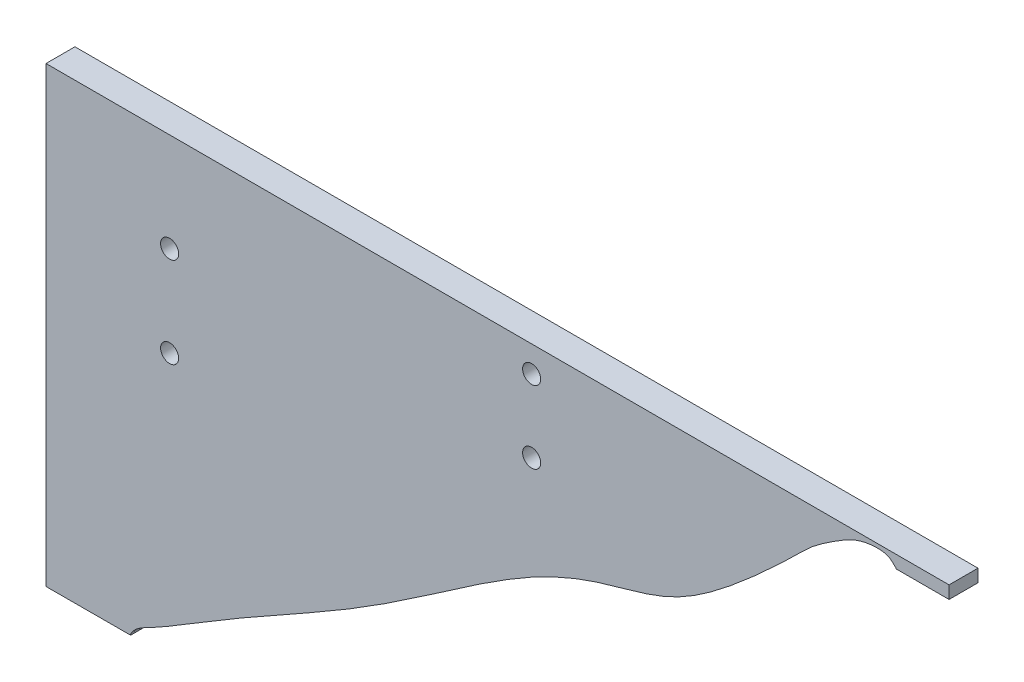
ISO-10303-21;
HEADER;
FILE_DESCRIPTION(('STEP AP214'),'2;1');
FILE_NAME('part.step','',(''),(''),'','','');
FILE_SCHEMA(('AUTOMOTIVE_DESIGN { 1 0 10303 214 1 1 1 1 }'));
ENDSEC;
DATA;
#1=APPLICATION_CONTEXT('core data for automotive mechanical design processes');
#2=APPLICATION_PROTOCOL_DEFINITION('international standard','automotive_design',2000,#1);
#3=PRODUCT_CONTEXT('',#1,'mechanical');
#4=PRODUCT('Part','Part','',(#3));
#5=PRODUCT_RELATED_PRODUCT_CATEGORY('part','',(#4));
#6=PRODUCT_DEFINITION_FORMATION('','',#4);
#7=PRODUCT_DEFINITION_CONTEXT('part definition',#1,'design');
#8=PRODUCT_DEFINITION('design','',#6,#7);
#9=PRODUCT_DEFINITION_SHAPE('','',#8);
#10=(LENGTH_UNIT() NAMED_UNIT(*) SI_UNIT(.MILLI.,.METRE.));
#11=(NAMED_UNIT(*) PLANE_ANGLE_UNIT() SI_UNIT($,.RADIAN.));
#12=(NAMED_UNIT(*) SI_UNIT($,.STERADIAN.) SOLID_ANGLE_UNIT());
#13=UNCERTAINTY_MEASURE_WITH_UNIT(LENGTH_MEASURE(1.E-05),#10,'distance_accuracy_value','');
#14=(GEOMETRIC_REPRESENTATION_CONTEXT(3) GLOBAL_UNCERTAINTY_ASSIGNED_CONTEXT((#13)) GLOBAL_UNIT_ASSIGNED_CONTEXT((#10,
#11,#12)) REPRESENTATION_CONTEXT('',''));
#15=CARTESIAN_POINT('',(0.,0.,0.));
#16=DIRECTION('',(0.,0.,1.));
#17=DIRECTION('',(1.,0.,0.));
#18=AXIS2_PLACEMENT_3D('',#15,#16,#17);
#19=CARTESIAN_POINT('',(-122.475415012518,-122.937391800223,91.9999999999997));
#20=DIRECTION('',(0.,0.,-1.));
#21=DIRECTION('',(-1.,0.,0.));
#22=AXIS2_PLACEMENT_3D('',#19,#20,#21);
#23=PLANE('',#22);
#24=CARTESIAN_POINT('',(-100.,-50.,91.9999999999997));
#25=DIRECTION('',(0.,0.,-1.));
#26=DIRECTION('',(-1.,0.,0.));
#27=AXIS2_PLACEMENT_3D('',#24,#25,#26);
#28=CIRCLE('',#27,2.5);
#29=CARTESIAN_POINT('',(-102.5,-50.,91.9999999999997));
#30=VERTEX_POINT('',#29);
#31=EDGE_CURVE('E199',#30,#30,#28,.F.);
#32=ORIENTED_EDGE('',*,*,#31,.F.);
#33=EDGE_LOOP('',(#32));
#34=FACE_BOUND('',#33,.T.);
#35=CARTESIAN_POINT('',(0.0705666698621599,-4.96037406111782,91.9999999999997));
#36=DIRECTION('',(0.,0.,-1.));
#37=DIRECTION('',(-1.,0.,0.));
#38=AXIS2_PLACEMENT_3D('',#35,#36,#37);
#39=CIRCLE('',#38,2.5);
#40=CARTESIAN_POINT('',(-2.42943333013784,-4.96037406111782,91.9999999999997));
#41=VERTEX_POINT('',#40);
#42=EDGE_CURVE('E187',#41,#41,#39,.F.);
#43=ORIENTED_EDGE('',*,*,#42,.F.);
#44=EDGE_LOOP('',(#43));
#45=FACE_BOUND('',#44,.T.);
#46=CARTESIAN_POINT('',(-110.779909772437,-122.917976824599,91.9999999999997));
#47=CARTESIAN_POINT('',(-118.576912590591,-122.931319085531,91.9999999999997));
#48=CARTESIAN_POINT('',(-126.373916925471,-122.943776546158,91.9999999999997));
#49=CARTESIAN_POINT('',(-134.170921779523,-122.955870682117,91.9999999999997));
#50=B_SPLINE_CURVE_WITH_KNOTS('',3,(#46,#47,#48,#49),.UNSPECIFIED.,.F.,.F.,(4,4),(0.,1.),.UNSPECIFIED.);
#51=CARTESIAN_POINT('',(-134.170921779523,-122.955870682117,91.9999999999997));
#52=VERTEX_POINT('',#51);
#53=CARTESIAN_POINT('',(-110.779909772437,-122.917976824599,91.9999999999997));
#54=VERTEX_POINT('',#53);
#55=EDGE_CURVE('E242',#52,#54,#50,.F.);
#56=ORIENTED_EDGE('',*,*,#55,.T.);
#57=CARTESIAN_POINT('',(100.876446256566,-1.24008902789555,91.9999999999997));
#58=CARTESIAN_POINT('',(100.841434361307,-1.16268302869262,91.9999999999997));
#59=CARTESIAN_POINT('',(100.795758852051,-1.08920582350783,91.9999999999997));
#60=CARTESIAN_POINT('',(100.694552201879,-0.957052484903109,91.9999999999997));
#61=CARTESIAN_POINT('',(100.638433165992,-0.896535745176627,91.9999999999997));
#62=CARTESIAN_POINT('',(100.463510985821,-0.72160322988411,91.9999999999997));
#63=CARTESIAN_POINT('',(100.339864724609,-0.612069397918408,91.9999999999997));
#64=CARTESIAN_POINT('',(100.096476173085,-0.389066465432534,91.9999999999997));
#65=CARTESIAN_POINT('',(99.977048832634,-0.275279890137775,91.9999999999997));
#66=CARTESIAN_POINT('',(99.7325886976846,-0.0533571318301582,91.9999999999997));
#67=CARTESIAN_POINT('',(99.6073133001585,0.0552814369014057,91.9999999999997));
#68=CARTESIAN_POINT('',(99.3501190169673,0.261403634544595,91.9999999999997));
#69=CARTESIAN_POINT('',(99.2180576863766,0.358495245572491,91.9999999999997));
#70=CARTESIAN_POINT('',(98.9410629528159,0.530497322472619,91.9999999999997));
#71=CARTESIAN_POINT('',(98.7965609056477,0.60615110032824,91.9999999999997));
#72=CARTESIAN_POINT('',(98.496281891785,0.738029723443443,91.9999999999997));
#73=CARTESIAN_POINT('',(98.3396401617321,0.794694064636087,91.9999999999997));
#74=CARTESIAN_POINT('',(98.0229449261277,0.891175631249163,91.9999999999997));
#75=CARTESIAN_POINT('',(97.8630532314017,0.93125487294844,91.9999999999997));
#76=CARTESIAN_POINT('',(97.3799894701756,1.03358103658415,91.9999999999997));
#77=CARTESIAN_POINT('',(97.0538125313495,1.07994507721183,91.9999999999997));
#78=CARTESIAN_POINT('',(96.3961078883297,1.14439056871508,91.9999999999997));
#79=CARTESIAN_POINT('',(96.0665866112686,1.15944962433049,91.9999999999997));
#80=CARTESIAN_POINT('',(95.0838366968023,1.16739371510432,91.9999999999997));
#81=CARTESIAN_POINT('',(94.4322845698842,1.12846032068188,91.9999999999997));
#82=CARTESIAN_POINT('',(93.134939397197,0.980121201641978,91.9999999999997));
#83=CARTESIAN_POINT('',(92.4883222303207,0.869756416043662,91.9999999999997));
#84=CARTESIAN_POINT('',(91.2049806622367,0.573919207752296,91.9999999999997));
#85=CARTESIAN_POINT('',(90.5762284552639,0.389217492510174,91.9999999999997));
#86=CARTESIAN_POINT('',(89.345794561168,-0.0572639268071072,91.9999999999997));
#87=CARTESIAN_POINT('',(88.7428792358786,-0.318463771538182,91.9999999999997));
#88=CARTESIAN_POINT('',(87.5601008028295,-0.893972784888488,91.9999999999997));
#89=CARTESIAN_POINT('',(86.9843798106607,-1.20583730253301,91.9999999999997));
#90=CARTESIAN_POINT('',(85.8516475937055,-1.85835662615235,91.9999999999997));
#91=CARTESIAN_POINT('',(85.2946975482809,-2.19910557394236,91.9999999999997));
#92=CARTESIAN_POINT('',(84.1889584545599,-2.8931614802975,91.9999999999997));
#93=CARTESIAN_POINT('',(83.6396615233533,-3.24568691683059,91.9999999999997));
#94=CARTESIAN_POINT('',(82.5463050959655,-3.95879707045348,91.9999999999997));
#95=CARTESIAN_POINT('',(82.0026525497169,-4.32000799553722,91.9999999999997));
#96=CARTESIAN_POINT('',(80.9217280472845,-5.05224819480175,91.9999999999997));
#97=CARTESIAN_POINT('',(80.3847596894359,-5.42374464120453,91.9999999999997));
#98=CARTESIAN_POINT('',(79.3227337258183,-6.18506560723509,91.9999999999997));
#99=CARTESIAN_POINT('',(78.7977798173924,-6.57504969466231,91.9999999999997));
#100=CARTESIAN_POINT('',(77.7673554106563,-7.38499862680852,91.9999999999997));
#101=CARTESIAN_POINT('',(77.2623439069601,-7.80511433379332,91.9999999999997));
#102=CARTESIAN_POINT('',(75.7931655035556,-9.11256261523159,91.9999999999997));
#103=CARTESIAN_POINT('',(74.8738653135943,-10.0511070655327,91.9999999999997));
#104=CARTESIAN_POINT('',(73.4872509377488,-11.4489306435438,91.9999999999997));
#105=CARTESIAN_POINT('',(73.0233566039029,-11.913119672155,91.9999999999997));
#106=CARTESIAN_POINT('',(72.0856875987397,-12.8312511813419,91.9999999999997));
#107=CARTESIAN_POINT('',(71.6129819736303,-13.2863023318747,91.9999999999997));
#108=CARTESIAN_POINT('',(70.1884851503201,-14.6448393653954,91.9999999999997));
#109=CARTESIAN_POINT('',(69.2328499513871,-15.5443387713761,91.9999999999997));
#110=CARTESIAN_POINT('',(67.3210602642904,-17.3427990468695,91.9999999999997));
#111=CARTESIAN_POINT('',(66.36227455184,-18.2393437225724,91.9999999999997));
#112=CARTESIAN_POINT('',(64.4314417002473,-20.0164079380949,91.9999999999997));
#113=CARTESIAN_POINT('',(63.459951980284,-20.8976249785016,91.9999999999997));
#114=CARTESIAN_POINT('',(60.5273679708992,-23.5194574061871,91.9999999999997));
#115=CARTESIAN_POINT('',(58.5493958786976,-25.2397440788112,91.9999999999997));
#116=CARTESIAN_POINT('',(54.5230437172046,-28.5955135136024,91.9999999999997));
#117=CARTESIAN_POINT('',(52.4756271482874,-30.2321567777871,91.9999999999997));
#118=CARTESIAN_POINT('',(49.3193274087806,-32.5845315455701,91.9999999999997));
#119=CARTESIAN_POINT('',(48.2514493387444,-33.3521626116681,91.9999999999997));
#120=CARTESIAN_POINT('',(46.0814896072829,-34.8352074526012,91.9999999999997));
#121=CARTESIAN_POINT('',(44.9835516762248,-35.5470279987799,91.9999999999997));
#122=CARTESIAN_POINT('',(42.7544603940462,-36.894534251084,91.9999999999997));
#123=CARTESIAN_POINT('',(41.6235384725537,-37.5307504294317,91.9999999999997));
#124=CARTESIAN_POINT('',(39.3250431338651,-38.7191719334006,91.9999999999997));
#125=CARTESIAN_POINT('',(38.1573577987336,-39.2711207259387,91.9999999999997));
#126=CARTESIAN_POINT('',(35.7849340022359,-40.2900868594757,91.9999999999997));
#127=CARTESIAN_POINT('',(34.5800929142975,-40.7568689646223,91.9999999999997));
#128=CARTESIAN_POINT('',(32.1395293327347,-41.6196482539924,91.9999999999997));
#129=CARTESIAN_POINT('',(30.9039178901933,-42.01589998434,91.9999999999997));
#130=CARTESIAN_POINT('',(27.1706011089081,-43.1439533275694,91.9999999999997));
#131=CARTESIAN_POINT('',(24.6480854611637,-43.8203816439177,91.9999999999997));
#132=CARTESIAN_POINT('',(20.8983147329225,-44.9070516093297,91.9999999999997));
#133=CARTESIAN_POINT('',(19.6539517476744,-45.2804633253454,91.9999999999997));
#134=CARTESIAN_POINT('',(17.1850349391526,-46.0671445206717,91.9999999999997));
#135=CARTESIAN_POINT('',(15.9605034827833,-46.4804590041466,91.9999999999997));
#136=CARTESIAN_POINT('',(12.3210224662823,-47.7890414982198,91.9999999999997));
#137=CARTESIAN_POINT('',(9.94117621178341,-48.7549404243807,91.9999999999997));
#138=CARTESIAN_POINT('',(2.93798730764382,-51.9269850236628,91.9999999999997));
#139=CARTESIAN_POINT('',(-1.55037774144483,-54.4047174130653,91.9999999999997));
#140=CARTESIAN_POINT('',(-10.3311618683811,-59.7544425927085,91.9999999999997));
#141=CARTESIAN_POINT('',(-14.6257991341576,-62.6228943627703,91.9999999999997));
#142=CARTESIAN_POINT('',(-23.1623666173545,-68.4620677112463,91.9999999999997));
#143=CARTESIAN_POINT('',(-27.4022047169036,-71.4255508076582,91.9999999999997));
#144=CARTESIAN_POINT('',(-35.9481520134817,-77.2502495224671,91.9999999999997));
#145=CARTESIAN_POINT('',(-40.2541037036712,-80.1117082004764,91.9999999999997));
#146=CARTESIAN_POINT('',(-46.8110821322596,-84.2525871558238,91.9999999999997));
#147=CARTESIAN_POINT('',(-49.0125921284208,-85.6084201159259,91.9999999999997));
#148=CARTESIAN_POINT('',(-53.447124025235,-88.271457853976,91.9999999999997));
#149=CARTESIAN_POINT('',(-55.6800810820948,-89.5787626968307,91.9999999999997));
#150=CARTESIAN_POINT('',(-62.4131435910692,-93.4479142249231,91.9999999999997));
#151=CARTESIAN_POINT('',(-66.9447883106522,-95.9532816488879,91.9999999999997));
#152=CARTESIAN_POINT('',(-73.7099355535082,-99.7671392919062,91.9999999999997));
#153=CARTESIAN_POINT('',(-75.9597115067248,-101.047737889698,91.9999999999997));
#154=CARTESIAN_POINT('',(-80.4442864915794,-103.635385388777,91.9999999999997));
#155=CARTESIAN_POINT('',(-82.6789826219114,-104.942451338412,91.9999999999997));
#156=CARTESIAN_POINT('',(-87.134084587971,-107.58066219383,91.9999999999997));
#157=CARTESIAN_POINT('',(-89.3539425718177,-108.912703314124,91.9999999999997));
#158=CARTESIAN_POINT('',(-93.7820176833245,-111.596025105117,91.9999999999997));
#159=CARTESIAN_POINT('',(-95.9931050813148,-112.942583088309,91.9999999999997));
#160=CARTESIAN_POINT('',(-99.3174347800966,-114.949619672127,91.9999999999997));
#161=CARTESIAN_POINT('',(-100.426520581914,-115.61700086954,91.9999999999997));
#162=CARTESIAN_POINT('',(-102.097003321082,-116.606617712562,91.9999999999997));
#163=CARTESIAN_POINT('',(-102.656265300541,-116.932682767015,91.9999999999997));
#164=CARTESIAN_POINT('',(-103.786179076839,-117.563290282006,91.9999999999997));
#165=CARTESIAN_POINT('',(-104.358188779308,-117.865419804243,91.9999999999997));
#166=CARTESIAN_POINT('',(-105.509797140658,-118.455503132099,91.9999999999997));
#167=CARTESIAN_POINT('',(-106.08849213202,-118.745144934588,91.9999999999997));
#168=CARTESIAN_POINT('',(-107.233118169313,-119.34827082611,91.9999999999997));
#169=CARTESIAN_POINT('',(-107.802192065386,-119.660987114854,91.9999999999997));
#170=CARTESIAN_POINT('',(-108.60556256135,-120.196591931237,91.9999999999997));
#171=CARTESIAN_POINT('',(-108.864898964107,-120.386394312925,91.9999999999997));
#172=CARTESIAN_POINT('',(-109.356865349896,-120.801594239617,91.9999999999997));
#173=CARTESIAN_POINT('',(-109.589268482181,-121.030006931974,91.9999999999997));
#174=CARTESIAN_POINT('',(-110.023739984723,-121.513057885008,91.9999999999997));
#175=CARTESIAN_POINT('',(-110.225125681924,-121.766767555702,91.9999999999997));
#176=CARTESIAN_POINT('',(-110.504474164165,-122.164805031038,91.9999999999997));
#177=CARTESIAN_POINT('',(-110.594963214295,-122.30104912406,91.9999999999997));
#178=CARTESIAN_POINT('',(-110.704604184103,-122.520289156973,91.9999999999997));
#179=CARTESIAN_POINT('',(-110.735979330843,-122.595415532006,91.9999999999997));
#180=CARTESIAN_POINT('',(-110.777984443431,-122.753876611485,91.9999999999997));
#181=CARTESIAN_POINT('',(-110.787807921688,-122.835938296205,91.9999999999997));
#182=CARTESIAN_POINT('',(-110.779909772437,-122.917976824599,91.9999999999997));
#183=B_SPLINE_CURVE_WITH_KNOTS('',3,(#57,#58,#59,#60,#61,#62,#63,#64,#65,#66,#67,#68,#69,#70,
#71,#72,#73,#74,#75,#76,#77,#78,#79,#80,#81,#82,#83,#84,#85,#86,#87,#88,#89,#90,#91,#92,#93,#94,
#95,#96,#97,#98,#99,#100,#101,#102,#103,#104,#105,#106,#107,#108,#109,#110,#111,#112,#113,#114,
#115,#116,#117,#118,#119,#120,#121,#122,#123,#124,#125,#126,#127,#128,#129,#130,#131,#132,#133,
#134,#135,#136,#137,#138,#139,#140,#141,#142,#143,#144,#145,#146,#147,#148,#149,#150,#151,#152,
#153,#154,#155,#156,#157,#158,#159,#160,#161,#162,#163,#164,#165,#166,#167,#168,#169,#170,#171,
#172,#173,#174,#175,#176,#177,#178,#179,#180,#181,#182),.UNSPECIFIED.,.F.,.F.,(4,2,2,2,2,2,2,2,
2,2,2,2,2,2,2,2,2,2,2,2,2,2,2,2,2,2,2,2,2,2,2,2,2,2,2,2,2,2,2,2,2,2,2,2,2,2,2,2,2,2,2,2,2,2,2,2,
2,2,2,2,2,2,4),(0.,0.000976562499999889,0.00195312499999978,0.00390624999999978,
0.00585937499999967,0.00781249999999967,0.00976562499999956,0.0117187499999994,
0.0136718749999994,0.0156249999999993,0.0195312499999993,0.0234374999999993,0.0312499999999993,
0.0390624999999994,0.0468749999999996,0.0546874999999996,0.0624999999999997,0.0703124999999998,
0.0781249999999998,0.0859374999999999,0.0937499999999999,0.1015625,0.109375,0.125,0.1328125,
0.140625,0.15625,0.171875,0.1875,0.21875,0.25,0.265625,0.28125,0.296875,0.3125,0.328125,0.34375,
0.375,0.390625,0.40625,0.4375,0.5,0.5625,0.624999999999999,0.687499999999999,0.718749999999999,
0.749999999999999,0.812499999999999,0.84375,0.875,0.90625,0.9375,0.953125,0.9609375,0.96875,
0.9765625,0.984375,0.98828125,0.9921875,0.99609375,0.998046875,0.9990234375,1.),.UNSPECIFIED.);
#184=CARTESIAN_POINT('',(100.876446256566,-1.24008902789559,91.9999999999997));
#185=VERTEX_POINT('',#184);
#186=EDGE_CURVE('E88',#54,#185,#183,.F.);
#187=ORIENTED_EDGE('',*,*,#186,.T.);
#188=CARTESIAN_POINT('',(115.455297384896,-1.24550931401802,91.9999999999997));
#189=CARTESIAN_POINT('',(110.595680322603,-1.2437558289701,91.9999999999997));
#190=CARTESIAN_POINT('',(105.736063276648,-1.24195583287216,91.9999999999997));
#191=CARTESIAN_POINT('',(100.876446256566,-1.24008902789559,91.9999999999997));
#192=B_SPLINE_CURVE_WITH_KNOTS('',3,(#188,#189,#190,#191),.UNSPECIFIED.,.F.,.F.,(4,4),(0.,1.),.UNSPECIFIED.);
#193=CARTESIAN_POINT('',(115.455297384896,-1.24550931401802,91.9999999999997));
#194=VERTEX_POINT('',#193);
#195=EDGE_CURVE('E102',#185,#194,#192,.F.);
#196=ORIENTED_EDGE('',*,*,#195,.T.);
#197=DIRECTION('',(0.,1.,0.));
#198=VECTOR('',#197,1.);
#199=CARTESIAN_POINT('',(115.455297384896,2.25600000000003,91.9999999999997));
#200=LINE('',#199,#198);
#201=CARTESIAN_POINT('',(115.455297384896,2.25600000000003,91.9999999999997));
#202=VERTEX_POINT('',#201);
#203=EDGE_CURVE('E96',#194,#202,#200,.T.);
#204=ORIENTED_EDGE('',*,*,#203,.T.);
#205=DIRECTION('',(-1.,0.,0.));
#206=VECTOR('',#205,1.);
#207=CARTESIAN_POINT('',(115.455297384896,2.25600000000003,91.9999999999997));
#208=LINE('',#207,#206);
#209=CARTESIAN_POINT('',(-134.170921779523,2.25600000000001,91.9999999999997));
#210=VERTEX_POINT('',#209);
#211=EDGE_CURVE('E100',#202,#210,#208,.T.);
#212=ORIENTED_EDGE('',*,*,#211,.T.);
#213=DIRECTION('',(0.,-1.,0.));
#214=VECTOR('',#213,1.);
#215=CARTESIAN_POINT('',(-134.170921779523,-122.955870682117,91.9999999999997));
#216=LINE('',#215,#214);
#217=EDGE_CURVE('E51',#210,#52,#216,.T.);
#218=ORIENTED_EDGE('',*,*,#217,.T.);
#219=EDGE_LOOP('',(#56,#187,#196,#204,#212,#218));
#220=FACE_BOUND('',#219,.T.);
#221=CARTESIAN_POINT('',(0.0705666698621599,-25.,91.9999999999997));
#222=DIRECTION('',(0.,0.,-1.));
#223=DIRECTION('',(-1.,0.,0.));
#224=AXIS2_PLACEMENT_3D('',#221,#222,#223);
#225=CIRCLE('',#224,2.5);
#226=CARTESIAN_POINT('',(-2.42943333013784,-25.,91.9999999999997));
#227=VERTEX_POINT('',#226);
#228=EDGE_CURVE('E195',#227,#227,#225,.F.);
#229=ORIENTED_EDGE('',*,*,#228,.F.);
#230=EDGE_LOOP('',(#229));
#231=FACE_BOUND('',#230,.T.);
#232=CARTESIAN_POINT('',(-100.,-25.,91.9999999999997));
#233=DIRECTION('',(0.,0.,-1.));
#234=DIRECTION('',(-1.,0.,0.));
#235=AXIS2_PLACEMENT_3D('',#232,#233,#234);
#236=CIRCLE('',#235,2.5);
#237=CARTESIAN_POINT('',(-102.5,-25.,91.9999999999997));
#238=VERTEX_POINT('',#237);
#239=EDGE_CURVE('E203',#238,#238,#236,.F.);
#240=ORIENTED_EDGE('',*,*,#239,.F.);
#241=EDGE_LOOP('',(#240));
#242=FACE_BOUND('',#241,.T.);
#243=ADVANCED_FACE('F30',(#34,#45,#220,#231,#242),#23,.F.);
#244=CARTESIAN_POINT('',(-122.475415012518,-122.937391800223,83.9999999999997));
#245=DIRECTION('',(0.,0.,-1.));
#246=DIRECTION('',(-1.,0.,0.));
#247=AXIS2_PLACEMENT_3D('',#244,#245,#246);
#248=PLANE('',#247);
#249=CARTESIAN_POINT('',(-100.,-50.,83.9999999999997));
#250=DIRECTION('',(0.,0.,-1.));
#251=DIRECTION('',(-1.,0.,0.));
#252=AXIS2_PLACEMENT_3D('',#249,#250,#251);
#253=CIRCLE('',#252,2.5);
#254=CARTESIAN_POINT('',(-102.5,-50.,83.9999999999997));
#255=VERTEX_POINT('',#254);
#256=EDGE_CURVE('E202',#255,#255,#253,.F.);
#257=ORIENTED_EDGE('',*,*,#256,.T.);
#258=EDGE_LOOP('',(#257));
#259=FACE_BOUND('',#258,.T.);
#260=CARTESIAN_POINT('',(0.0705666698621599,-4.96037406111782,83.9999999999997));
#261=DIRECTION('',(0.,0.,-1.));
#262=DIRECTION('',(-1.,0.,0.));
#263=AXIS2_PLACEMENT_3D('',#260,#261,#262);
#264=CIRCLE('',#263,2.5);
#265=CARTESIAN_POINT('',(-2.42943333013784,-4.96037406111782,83.9999999999997));
#266=VERTEX_POINT('',#265);
#267=EDGE_CURVE('E194',#266,#266,#264,.F.);
#268=ORIENTED_EDGE('',*,*,#267,.T.);
#269=EDGE_LOOP('',(#268));
#270=FACE_BOUND('',#269,.T.);
#271=CARTESIAN_POINT('',(-134.170921779523,-122.955870682117,83.9999999999997));
#272=CARTESIAN_POINT('',(-126.373916925471,-122.943776546158,83.9999999999997));
#273=CARTESIAN_POINT('',(-118.576912590591,-122.931319085531,83.9999999999997));
#274=CARTESIAN_POINT('',(-110.779909772437,-122.917976824599,83.9999999999997));
#275=B_SPLINE_CURVE_WITH_KNOTS('',3,(#271,#272,#273,#274),.UNSPECIFIED.,.F.,.F.,(4,4),(0.,1.),.UNSPECIFIED.);
#276=CARTESIAN_POINT('',(-134.170921779523,-122.955870682117,83.9999999999997));
#277=VERTEX_POINT('',#276);
#278=CARTESIAN_POINT('',(-110.779909772437,-122.917976824599,83.9999999999997));
#279=VERTEX_POINT('',#278);
#280=EDGE_CURVE('E193',#277,#279,#275,.T.);
#281=ORIENTED_EDGE('',*,*,#280,.F.);
#282=DIRECTION('',(0.,-1.,0.));
#283=VECTOR('',#282,1.);
#284=CARTESIAN_POINT('',(-134.170921779523,-122.955870682117,83.9999999999997));
#285=LINE('',#284,#283);
#286=CARTESIAN_POINT('',(-134.170921779523,2.25600000000001,83.9999999999997));
#287=VERTEX_POINT('',#286);
#288=EDGE_CURVE('E80',#287,#277,#285,.T.);
#289=ORIENTED_EDGE('',*,*,#288,.F.);
#290=DIRECTION('',(-1.,0.,0.));
#291=VECTOR('',#290,1.);
#292=CARTESIAN_POINT('',(115.455297384896,2.25600000000003,83.9999999999997));
#293=LINE('',#292,#291);
#294=CARTESIAN_POINT('',(115.455297384896,2.25600000000003,83.9999999999997));
#295=VERTEX_POINT('',#294);
#296=EDGE_CURVE('E74',#295,#287,#293,.T.);
#297=ORIENTED_EDGE('',*,*,#296,.F.);
#298=DIRECTION('',(0.,1.,0.));
#299=VECTOR('',#298,1.);
#300=CARTESIAN_POINT('',(115.455297384896,2.25600000000003,83.9999999999997));
#301=LINE('',#300,#299);
#302=CARTESIAN_POINT('',(115.455297384896,-1.24550931401802,83.9999999999997));
#303=VERTEX_POINT('',#302);
#304=EDGE_CURVE('E111',#303,#295,#301,.T.);
#305=ORIENTED_EDGE('',*,*,#304,.F.);
#306=CARTESIAN_POINT('',(100.876446256566,-1.24008902789559,83.9999999999997));
#307=CARTESIAN_POINT('',(105.736063276648,-1.24195583287216,83.9999999999997));
#308=CARTESIAN_POINT('',(110.595680322603,-1.2437558289701,83.9999999999997));
#309=CARTESIAN_POINT('',(115.455297384896,-1.24550931401802,83.9999999999997));
#310=B_SPLINE_CURVE_WITH_KNOTS('',3,(#306,#307,#308,#309),.UNSPECIFIED.,.F.,.F.,(4,4),(0.,1.),.UNSPECIFIED.);
#311=CARTESIAN_POINT('',(100.876446256566,-1.24008902789559,83.9999999999997));
#312=VERTEX_POINT('',#311);
#313=EDGE_CURVE('E310',#312,#303,#310,.T.);
#314=ORIENTED_EDGE('',*,*,#313,.F.);
#315=CARTESIAN_POINT('',(-110.779909772437,-122.917976824599,83.9999999999997));
#316=CARTESIAN_POINT('',(-110.787807921688,-122.835938296205,83.9999999999997));
#317=CARTESIAN_POINT('',(-110.777984443431,-122.753876611485,83.9999999999997));
#318=CARTESIAN_POINT('',(-110.735979330843,-122.595415532006,83.9999999999997));
#319=CARTESIAN_POINT('',(-110.704604184103,-122.520289156973,83.9999999999997));
#320=CARTESIAN_POINT('',(-110.594963214295,-122.30104912406,83.9999999999997));
#321=CARTESIAN_POINT('',(-110.504474164165,-122.164805031038,83.9999999999997));
#322=CARTESIAN_POINT('',(-110.225125681924,-121.766767555702,83.9999999999997));
#323=CARTESIAN_POINT('',(-110.023739984723,-121.513057885008,83.9999999999997));
#324=CARTESIAN_POINT('',(-109.589268482181,-121.030006931974,83.9999999999997));
#325=CARTESIAN_POINT('',(-109.356865349896,-120.801594239617,83.9999999999997));
#326=CARTESIAN_POINT('',(-108.864898964107,-120.386394312925,83.9999999999997));
#327=CARTESIAN_POINT('',(-108.60556256135,-120.196591931237,83.9999999999997));
#328=CARTESIAN_POINT('',(-107.802192065386,-119.660987114854,83.9999999999997));
#329=CARTESIAN_POINT('',(-107.233118169313,-119.34827082611,83.9999999999997));
#330=CARTESIAN_POINT('',(-106.08849213202,-118.745144934588,83.9999999999997));
#331=CARTESIAN_POINT('',(-105.509797140658,-118.455503132099,83.9999999999997));
#332=CARTESIAN_POINT('',(-104.358188779308,-117.865419804243,83.9999999999997));
#333=CARTESIAN_POINT('',(-103.786179076839,-117.563290282006,83.9999999999997));
#334=CARTESIAN_POINT('',(-102.656265300541,-116.932682767015,83.9999999999997));
#335=CARTESIAN_POINT('',(-102.097003321082,-116.606617712562,83.9999999999997));
#336=CARTESIAN_POINT('',(-100.426520581914,-115.61700086954,83.9999999999997));
#337=CARTESIAN_POINT('',(-99.3174347800966,-114.949619672127,83.9999999999997));
#338=CARTESIAN_POINT('',(-95.9931050813148,-112.942583088309,83.9999999999997));
#339=CARTESIAN_POINT('',(-93.7820176833245,-111.596025105117,83.9999999999997));
#340=CARTESIAN_POINT('',(-89.3539425718177,-108.912703314124,83.9999999999997));
#341=CARTESIAN_POINT('',(-87.134084587971,-107.58066219383,83.9999999999997));
#342=CARTESIAN_POINT('',(-82.6789826219114,-104.942451338412,83.9999999999997));
#343=CARTESIAN_POINT('',(-80.4442864915794,-103.635385388777,83.9999999999997));
#344=CARTESIAN_POINT('',(-75.9597115067248,-101.047737889698,83.9999999999997));
#345=CARTESIAN_POINT('',(-73.7099355535082,-99.7671392919062,83.9999999999997));
#346=CARTESIAN_POINT('',(-66.9447883106522,-95.9532816488879,83.9999999999997));
#347=CARTESIAN_POINT('',(-62.4131435910692,-93.4479142249231,83.9999999999997));
#348=CARTESIAN_POINT('',(-55.6800810820948,-89.5787626968307,83.9999999999997));
#349=CARTESIAN_POINT('',(-53.447124025235,-88.271457853976,83.9999999999997));
#350=CARTESIAN_POINT('',(-49.0125921284208,-85.6084201159259,83.9999999999997));
#351=CARTESIAN_POINT('',(-46.8110821322596,-84.2525871558238,83.9999999999997));
#352=CARTESIAN_POINT('',(-40.2541037036712,-80.1117082004764,83.9999999999997));
#353=CARTESIAN_POINT('',(-35.9481520134817,-77.2502495224671,83.9999999999997));
#354=CARTESIAN_POINT('',(-27.4022047169036,-71.4255508076582,83.9999999999997));
#355=CARTESIAN_POINT('',(-23.1623666173545,-68.4620677112463,83.9999999999997));
#356=CARTESIAN_POINT('',(-14.6257991341576,-62.6228943627703,83.9999999999997));
#357=CARTESIAN_POINT('',(-10.3311618683811,-59.7544425927085,83.9999999999997));
#358=CARTESIAN_POINT('',(-1.55037774144483,-54.4047174130653,83.9999999999997));
#359=CARTESIAN_POINT('',(2.93798730764382,-51.9269850236628,83.9999999999997));
#360=CARTESIAN_POINT('',(9.94117621178341,-48.7549404243807,83.9999999999997));
#361=CARTESIAN_POINT('',(12.3210224662823,-47.7890414982198,83.9999999999997));
#362=CARTESIAN_POINT('',(15.9605034827833,-46.4804590041466,83.9999999999997));
#363=CARTESIAN_POINT('',(17.1850349391526,-46.0671445206717,83.9999999999997));
#364=CARTESIAN_POINT('',(19.6539517476744,-45.2804633253454,83.9999999999997));
#365=CARTESIAN_POINT('',(20.8983147329225,-44.9070516093297,83.9999999999997));
#366=CARTESIAN_POINT('',(24.6480854611637,-43.8203816439177,83.9999999999997));
#367=CARTESIAN_POINT('',(27.1706011089081,-43.1439533275694,83.9999999999997));
#368=CARTESIAN_POINT('',(30.9039178901933,-42.01589998434,83.9999999999997));
#369=CARTESIAN_POINT('',(32.1395293327347,-41.6196482539924,83.9999999999997));
#370=CARTESIAN_POINT('',(34.5800929142975,-40.7568689646223,83.9999999999997));
#371=CARTESIAN_POINT('',(35.7849340022359,-40.2900868594757,83.9999999999997));
#372=CARTESIAN_POINT('',(38.1573577987336,-39.2711207259387,83.9999999999997));
#373=CARTESIAN_POINT('',(39.3250431338651,-38.7191719334006,83.9999999999997));
#374=CARTESIAN_POINT('',(41.6235384725537,-37.5307504294317,83.9999999999997));
#375=CARTESIAN_POINT('',(42.7544603940462,-36.894534251084,83.9999999999997));
#376=CARTESIAN_POINT('',(44.9835516762248,-35.5470279987799,83.9999999999997));
#377=CARTESIAN_POINT('',(46.0814896072829,-34.8352074526012,83.9999999999997));
#378=CARTESIAN_POINT('',(48.2514493387444,-33.3521626116681,83.9999999999997));
#379=CARTESIAN_POINT('',(49.3193274087806,-32.5845315455701,83.9999999999997));
#380=CARTESIAN_POINT('',(52.4756271482874,-30.2321567777871,83.9999999999997));
#381=CARTESIAN_POINT('',(54.5230437172046,-28.5955135136024,83.9999999999997));
#382=CARTESIAN_POINT('',(58.5493958786976,-25.2397440788112,83.9999999999997));
#383=CARTESIAN_POINT('',(60.5273679708992,-23.5194574061871,83.9999999999997));
#384=CARTESIAN_POINT('',(63.459951980284,-20.8976249785016,83.9999999999997));
#385=CARTESIAN_POINT('',(64.4314417002473,-20.0164079380949,83.9999999999997));
#386=CARTESIAN_POINT('',(66.36227455184,-18.2393437225724,83.9999999999997));
#387=CARTESIAN_POINT('',(67.3210602642904,-17.3427990468695,83.9999999999997));
#388=CARTESIAN_POINT('',(69.2328499513871,-15.5443387713761,83.9999999999997));
#389=CARTESIAN_POINT('',(70.1884851503201,-14.6448393653954,83.9999999999997));
#390=CARTESIAN_POINT('',(71.6129819736303,-13.2863023318747,83.9999999999997));
#391=CARTESIAN_POINT('',(72.0856875987397,-12.8312511813419,83.9999999999997));
#392=CARTESIAN_POINT('',(73.0233566039029,-11.913119672155,83.9999999999997));
#393=CARTESIAN_POINT('',(73.4872509377488,-11.4489306435438,83.9999999999997));
#394=CARTESIAN_POINT('',(74.8738653135943,-10.0511070655327,83.9999999999997));
#395=CARTESIAN_POINT('',(75.7931655035556,-9.11256261523159,83.9999999999997));
#396=CARTESIAN_POINT('',(77.2623439069601,-7.80511433379332,83.9999999999997));
#397=CARTESIAN_POINT('',(77.7673554106563,-7.38499862680852,83.9999999999997));
#398=CARTESIAN_POINT('',(78.7977798173924,-6.57504969466231,83.9999999999997));
#399=CARTESIAN_POINT('',(79.3227337258183,-6.18506560723509,83.9999999999997));
#400=CARTESIAN_POINT('',(80.3847596894359,-5.42374464120453,83.9999999999997));
#401=CARTESIAN_POINT('',(80.9217280472845,-5.05224819480175,83.9999999999997));
#402=CARTESIAN_POINT('',(82.0026525497169,-4.32000799553722,83.9999999999997));
#403=CARTESIAN_POINT('',(82.5463050959655,-3.95879707045348,83.9999999999997));
#404=CARTESIAN_POINT('',(83.6396615233533,-3.24568691683059,83.9999999999997));
#405=CARTESIAN_POINT('',(84.1889584545599,-2.8931614802975,83.9999999999997));
#406=CARTESIAN_POINT('',(85.2946975482809,-2.19910557394236,83.9999999999997));
#407=CARTESIAN_POINT('',(85.8516475937055,-1.85835662615235,83.9999999999997));
#408=CARTESIAN_POINT('',(86.9843798106607,-1.20583730253301,83.9999999999997));
#409=CARTESIAN_POINT('',(87.5601008028295,-0.893972784888488,83.9999999999997));
#410=CARTESIAN_POINT('',(88.7428792358786,-0.318463771538182,83.9999999999997));
#411=CARTESIAN_POINT('',(89.345794561168,-0.0572639268071072,83.9999999999997));
#412=CARTESIAN_POINT('',(90.5762284552639,0.389217492510174,83.9999999999997));
#413=CARTESIAN_POINT('',(91.2049806622367,0.573919207752296,83.9999999999997));
#414=CARTESIAN_POINT('',(92.4883222303207,0.869756416043662,83.9999999999997));
#415=CARTESIAN_POINT('',(93.134939397197,0.980121201641978,83.9999999999997));
#416=CARTESIAN_POINT('',(94.4322845698842,1.12846032068188,83.9999999999997));
#417=CARTESIAN_POINT('',(95.0838366968023,1.16739371510432,83.9999999999997));
#418=CARTESIAN_POINT('',(96.0665866112686,1.15944962433049,83.9999999999997));
#419=CARTESIAN_POINT('',(96.3961078883297,1.14439056871508,83.9999999999997));
#420=CARTESIAN_POINT('',(97.0538125313495,1.07994507721183,83.9999999999997));
#421=CARTESIAN_POINT('',(97.3799894701756,1.03358103658415,83.9999999999997));
#422=CARTESIAN_POINT('',(97.8630532314017,0.93125487294844,83.9999999999997));
#423=CARTESIAN_POINT('',(98.0229449261277,0.891175631249163,83.9999999999997));
#424=CARTESIAN_POINT('',(98.3396401617321,0.794694064636087,83.9999999999997));
#425=CARTESIAN_POINT('',(98.496281891785,0.738029723443443,83.9999999999997));
#426=CARTESIAN_POINT('',(98.7965609056477,0.60615110032824,83.9999999999997));
#427=CARTESIAN_POINT('',(98.9410629528159,0.530497322472619,83.9999999999997));
#428=CARTESIAN_POINT('',(99.2180576863766,0.358495245572491,83.9999999999997));
#429=CARTESIAN_POINT('',(99.3501190169673,0.261403634544595,83.9999999999997));
#430=CARTESIAN_POINT('',(99.6073133001585,0.0552814369014057,83.9999999999997));
#431=CARTESIAN_POINT('',(99.7325886976846,-0.0533571318301582,83.9999999999997));
#432=CARTESIAN_POINT('',(99.977048832634,-0.275279890137775,83.9999999999997));
#433=CARTESIAN_POINT('',(100.096476173085,-0.389066465432534,83.9999999999997));
#434=CARTESIAN_POINT('',(100.339864724609,-0.612069397918408,83.9999999999997));
#435=CARTESIAN_POINT('',(100.463510985821,-0.72160322988411,83.9999999999997));
#436=CARTESIAN_POINT('',(100.638433165992,-0.896535745176627,83.9999999999997));
#437=CARTESIAN_POINT('',(100.694552201879,-0.957052484903109,83.9999999999997));
#438=CARTESIAN_POINT('',(100.795758852051,-1.08920582350783,83.9999999999997));
#439=CARTESIAN_POINT('',(100.841434361307,-1.16268302869262,83.9999999999997));
#440=CARTESIAN_POINT('',(100.876446256566,-1.24008902789555,83.9999999999997));
#441=B_SPLINE_CURVE_WITH_KNOTS('',3,(#315,#316,#317,#318,#319,#320,#321,#322,#323,#324,#325,
#326,#327,#328,#329,#330,#331,#332,#333,#334,#335,#336,#337,#338,#339,#340,#341,#342,#343,#344,
#345,#346,#347,#348,#349,#350,#351,#352,#353,#354,#355,#356,#357,#358,#359,#360,#361,#362,#363,
#364,#365,#366,#367,#368,#369,#370,#371,#372,#373,#374,#375,#376,#377,#378,#379,#380,#381,#382,
#383,#384,#385,#386,#387,#388,#389,#390,#391,#392,#393,#394,#395,#396,#397,#398,#399,#400,#401,
#402,#403,#404,#405,#406,#407,#408,#409,#410,#411,#412,#413,#414,#415,#416,#417,#418,#419,#420,
#421,#422,#423,#424,#425,#426,#427,#428,#429,#430,#431,#432,#433,#434,#435,#436,#437,#438,#439,
#440),.UNSPECIFIED.,.F.,.F.,(4,2,2,2,2,2,2,2,2,2,2,2,2,2,2,2,2,2,2,2,2,2,2,2,2,2,2,2,2,2,2,2,2,
2,2,2,2,2,2,2,2,2,2,2,2,2,2,2,2,2,2,2,2,2,2,2,2,2,2,2,2,2,4),(0.,0.000976562500000023,
0.00195312500000005,0.00390625000000009,0.00781250000000004,0.01171875,0.0156249999999999,
0.0234375,0.03125,0.0390625000000001,0.0468750000000001,0.0625000000000001,0.0937500000000002,
0.125,0.15625,0.187500000000001,0.250000000000001,0.281250000000001,0.312500000000001,
0.375000000000001,0.4375,0.5,0.5625,0.59375,0.609375,0.625,0.65625,0.671875,0.6875,0.703125,
0.71875,0.734375,0.75,0.78125,0.8125,0.828125,0.84375,0.859375,0.8671875,0.875,0.890625,
0.8984375,0.90625,0.9140625,0.921875,0.9296875,0.9375,0.9453125,0.953125,0.960937500000001,
0.968750000000001,0.976562500000001,0.980468750000001,0.984375000000001,0.986328125000001,
0.988281250000001,0.990234375,0.9921875,0.994140625,0.99609375,0.998046875,0.9990234375,1.),.UNSPECIFIED.);
#442=EDGE_CURVE('E299',#279,#312,#441,.T.);
#443=ORIENTED_EDGE('',*,*,#442,.F.);
#444=EDGE_LOOP('',(#281,#289,#297,#305,#314,#443));
#445=FACE_BOUND('',#444,.T.);
#446=CARTESIAN_POINT('',(0.0705666698621599,-25.,83.9999999999997));
#447=DIRECTION('',(0.,0.,-1.));
#448=DIRECTION('',(-1.,0.,0.));
#449=AXIS2_PLACEMENT_3D('',#446,#447,#448);
#450=CIRCLE('',#449,2.5);
#451=CARTESIAN_POINT('',(-2.42943333013784,-25.,83.9999999999997));
#452=VERTEX_POINT('',#451);
#453=EDGE_CURVE('E198',#452,#452,#450,.F.);
#454=ORIENTED_EDGE('',*,*,#453,.T.);
#455=EDGE_LOOP('',(#454));
#456=FACE_BOUND('',#455,.T.);
#457=CARTESIAN_POINT('',(-100.,-25.,83.9999999999997));
#458=DIRECTION('',(0.,0.,-1.));
#459=DIRECTION('',(-1.,0.,0.));
#460=AXIS2_PLACEMENT_3D('',#457,#458,#459);
#461=CIRCLE('',#460,2.5);
#462=CARTESIAN_POINT('',(-102.5,-25.,83.9999999999997));
#463=VERTEX_POINT('',#462);
#464=EDGE_CURVE('E36',#463,#463,#461,.F.);
#465=ORIENTED_EDGE('',*,*,#464,.T.);
#466=EDGE_LOOP('',(#465));
#467=FACE_BOUND('',#466,.T.);
#468=ADVANCED_FACE('F141',(#259,#270,#445,#456,#467),#248,.T.);
#469=CARTESIAN_POINT('',(-134.170921779523,-122.955870682117,91.9999999999997));
#470=CARTESIAN_POINT('',(-126.373916925471,-122.943776546158,91.9999999999997));
#471=CARTESIAN_POINT('',(-118.576912590591,-122.931319085531,91.9999999999997));
#472=CARTESIAN_POINT('',(-110.779909772437,-122.917976824599,91.9999999999997));
#473=B_SPLINE_CURVE_WITH_KNOTS('',3,(#469,#470,#471,#472),.UNSPECIFIED.,.F.,.F.,(4,4),(0.,1.),.UNSPECIFIED.);
#474=DIRECTION('',(0.,0.,-1.));
#475=VECTOR('',#474,1.);
#476=SURFACE_OF_LINEAR_EXTRUSION('',#473,#475);
#477=ORIENTED_EDGE('',*,*,#280,.T.);
#478=DIRECTION('',(0.,0.,-1.));
#479=VECTOR('',#478,1.);
#480=CARTESIAN_POINT('',(-110.779909772437,-122.917976824599,91.9999999999997));
#481=LINE('',#480,#479);
#482=EDGE_CURVE('E11',#54,#279,#481,.T.);
#483=ORIENTED_EDGE('',*,*,#482,.F.);
#484=ORIENTED_EDGE('',*,*,#55,.F.);
#485=DIRECTION('',(0.,0.,-1.));
#486=VECTOR('',#485,1.);
#487=CARTESIAN_POINT('',(-134.170921779523,-122.955870682117,91.9999999999997));
#488=LINE('',#487,#486);
#489=EDGE_CURVE('E117',#52,#277,#488,.T.);
#490=ORIENTED_EDGE('',*,*,#489,.T.);
#491=EDGE_LOOP('',(#477,#483,#484,#490));
#492=FACE_BOUND('',#491,.T.);
#493=ADVANCED_FACE('F32',(#492),#476,.F.);
#494=CARTESIAN_POINT('',(-110.779909772437,-122.917976824599,91.9999999999997));
#495=CARTESIAN_POINT('',(-110.787807921688,-122.835938296205,91.9999999999997));
#496=CARTESIAN_POINT('',(-110.777984443431,-122.753876611485,91.9999999999997));
#497=CARTESIAN_POINT('',(-110.735979330843,-122.595415532006,91.9999999999997));
#498=CARTESIAN_POINT('',(-110.704604184103,-122.520289156973,91.9999999999997));
#499=CARTESIAN_POINT('',(-110.594963214295,-122.30104912406,91.9999999999997));
#500=CARTESIAN_POINT('',(-110.504474164165,-122.164805031038,91.9999999999997));
#501=CARTESIAN_POINT('',(-110.225125681924,-121.766767555702,91.9999999999997));
#502=CARTESIAN_POINT('',(-110.023739984723,-121.513057885008,91.9999999999997));
#503=CARTESIAN_POINT('',(-109.589268482181,-121.030006931974,91.9999999999997));
#504=CARTESIAN_POINT('',(-109.356865349896,-120.801594239617,91.9999999999997));
#505=CARTESIAN_POINT('',(-108.864898964107,-120.386394312925,91.9999999999997));
#506=CARTESIAN_POINT('',(-108.60556256135,-120.196591931237,91.9999999999997));
#507=CARTESIAN_POINT('',(-107.802192065386,-119.660987114854,91.9999999999997));
#508=CARTESIAN_POINT('',(-107.233118169313,-119.34827082611,91.9999999999997));
#509=CARTESIAN_POINT('',(-106.08849213202,-118.745144934588,91.9999999999997));
#510=CARTESIAN_POINT('',(-105.509797140658,-118.455503132099,91.9999999999997));
#511=CARTESIAN_POINT('',(-104.358188779308,-117.865419804243,91.9999999999997));
#512=CARTESIAN_POINT('',(-103.786179076839,-117.563290282006,91.9999999999997));
#513=CARTESIAN_POINT('',(-102.656265300541,-116.932682767015,91.9999999999997));
#514=CARTESIAN_POINT('',(-102.097003321082,-116.606617712562,91.9999999999997));
#515=CARTESIAN_POINT('',(-100.426520581914,-115.61700086954,91.9999999999997));
#516=CARTESIAN_POINT('',(-99.3174347800966,-114.949619672127,91.9999999999997));
#517=CARTESIAN_POINT('',(-95.9931050813148,-112.942583088309,91.9999999999997));
#518=CARTESIAN_POINT('',(-93.7820176833245,-111.596025105117,91.9999999999997));
#519=CARTESIAN_POINT('',(-89.3539425718177,-108.912703314124,91.9999999999997));
#520=CARTESIAN_POINT('',(-87.134084587971,-107.58066219383,91.9999999999997));
#521=CARTESIAN_POINT('',(-82.6789826219114,-104.942451338412,91.9999999999997));
#522=CARTESIAN_POINT('',(-80.4442864915794,-103.635385388777,91.9999999999997));
#523=CARTESIAN_POINT('',(-75.9597115067248,-101.047737889698,91.9999999999997));
#524=CARTESIAN_POINT('',(-73.7099355535082,-99.7671392919062,91.9999999999997));
#525=CARTESIAN_POINT('',(-66.9447883106522,-95.9532816488879,91.9999999999997));
#526=CARTESIAN_POINT('',(-62.4131435910692,-93.4479142249231,91.9999999999997));
#527=CARTESIAN_POINT('',(-55.6800810820948,-89.5787626968307,91.9999999999997));
#528=CARTESIAN_POINT('',(-53.447124025235,-88.271457853976,91.9999999999997));
#529=CARTESIAN_POINT('',(-49.0125921284208,-85.6084201159259,91.9999999999997));
#530=CARTESIAN_POINT('',(-46.8110821322596,-84.2525871558238,91.9999999999997));
#531=CARTESIAN_POINT('',(-40.2541037036712,-80.1117082004764,91.9999999999997));
#532=CARTESIAN_POINT('',(-35.9481520134817,-77.2502495224671,91.9999999999997));
#533=CARTESIAN_POINT('',(-27.4022047169036,-71.4255508076582,91.9999999999997));
#534=CARTESIAN_POINT('',(-23.1623666173545,-68.4620677112463,91.9999999999997));
#535=CARTESIAN_POINT('',(-14.6257991341576,-62.6228943627703,91.9999999999997));
#536=CARTESIAN_POINT('',(-10.3311618683811,-59.7544425927085,91.9999999999997));
#537=CARTESIAN_POINT('',(-1.55037774144483,-54.4047174130653,91.9999999999997));
#538=CARTESIAN_POINT('',(2.93798730764382,-51.9269850236628,91.9999999999997));
#539=CARTESIAN_POINT('',(9.94117621178341,-48.7549404243807,91.9999999999997));
#540=CARTESIAN_POINT('',(12.3210224662823,-47.7890414982198,91.9999999999997));
#541=CARTESIAN_POINT('',(15.9605034827833,-46.4804590041466,91.9999999999997));
#542=CARTESIAN_POINT('',(17.1850349391526,-46.0671445206717,91.9999999999997));
#543=CARTESIAN_POINT('',(19.6539517476744,-45.2804633253454,91.9999999999997));
#544=CARTESIAN_POINT('',(20.8983147329225,-44.9070516093297,91.9999999999997));
#545=CARTESIAN_POINT('',(24.6480854611637,-43.8203816439177,91.9999999999997));
#546=CARTESIAN_POINT('',(27.1706011089081,-43.1439533275694,91.9999999999997));
#547=CARTESIAN_POINT('',(30.9039178901933,-42.01589998434,91.9999999999997));
#548=CARTESIAN_POINT('',(32.1395293327347,-41.6196482539924,91.9999999999997));
#549=CARTESIAN_POINT('',(34.5800929142975,-40.7568689646223,91.9999999999997));
#550=CARTESIAN_POINT('',(35.7849340022359,-40.2900868594757,91.9999999999997));
#551=CARTESIAN_POINT('',(38.1573577987336,-39.2711207259387,91.9999999999997));
#552=CARTESIAN_POINT('',(39.3250431338651,-38.7191719334006,91.9999999999997));
#553=CARTESIAN_POINT('',(41.6235384725537,-37.5307504294317,91.9999999999997));
#554=CARTESIAN_POINT('',(42.7544603940462,-36.894534251084,91.9999999999997));
#555=CARTESIAN_POINT('',(44.9835516762248,-35.5470279987799,91.9999999999997));
#556=CARTESIAN_POINT('',(46.0814896072829,-34.8352074526012,91.9999999999997));
#557=CARTESIAN_POINT('',(48.2514493387444,-33.3521626116681,91.9999999999997));
#558=CARTESIAN_POINT('',(49.3193274087806,-32.5845315455701,91.9999999999997));
#559=CARTESIAN_POINT('',(52.4756271482874,-30.2321567777871,91.9999999999997));
#560=CARTESIAN_POINT('',(54.5230437172046,-28.5955135136024,91.9999999999997));
#561=CARTESIAN_POINT('',(58.5493958786976,-25.2397440788112,91.9999999999997));
#562=CARTESIAN_POINT('',(60.5273679708992,-23.5194574061871,91.9999999999997));
#563=CARTESIAN_POINT('',(63.459951980284,-20.8976249785016,91.9999999999997));
#564=CARTESIAN_POINT('',(64.4314417002473,-20.0164079380949,91.9999999999997));
#565=CARTESIAN_POINT('',(66.36227455184,-18.2393437225724,91.9999999999997));
#566=CARTESIAN_POINT('',(67.3210602642904,-17.3427990468695,91.9999999999997));
#567=CARTESIAN_POINT('',(69.2328499513871,-15.5443387713761,91.9999999999997));
#568=CARTESIAN_POINT('',(70.1884851503201,-14.6448393653954,91.9999999999997));
#569=CARTESIAN_POINT('',(71.6129819736303,-13.2863023318747,91.9999999999997));
#570=CARTESIAN_POINT('',(72.0856875987397,-12.8312511813419,91.9999999999997));
#571=CARTESIAN_POINT('',(73.0233566039029,-11.913119672155,91.9999999999997));
#572=CARTESIAN_POINT('',(73.4872509377488,-11.4489306435438,91.9999999999997));
#573=CARTESIAN_POINT('',(74.8738653135943,-10.0511070655327,91.9999999999997));
#574=CARTESIAN_POINT('',(75.7931655035556,-9.11256261523159,91.9999999999997));
#575=CARTESIAN_POINT('',(77.2623439069601,-7.80511433379332,91.9999999999997));
#576=CARTESIAN_POINT('',(77.7673554106563,-7.38499862680852,91.9999999999997));
#577=CARTESIAN_POINT('',(78.7977798173924,-6.57504969466231,91.9999999999997));
#578=CARTESIAN_POINT('',(79.3227337258183,-6.18506560723509,91.9999999999997));
#579=CARTESIAN_POINT('',(80.3847596894359,-5.42374464120453,91.9999999999997));
#580=CARTESIAN_POINT('',(80.9217280472845,-5.05224819480175,91.9999999999997));
#581=CARTESIAN_POINT('',(82.0026525497169,-4.32000799553722,91.9999999999997));
#582=CARTESIAN_POINT('',(82.5463050959655,-3.95879707045348,91.9999999999997));
#583=CARTESIAN_POINT('',(83.6396615233533,-3.24568691683059,91.9999999999997));
#584=CARTESIAN_POINT('',(84.1889584545599,-2.8931614802975,91.9999999999997));
#585=CARTESIAN_POINT('',(85.2946975482809,-2.19910557394236,91.9999999999997));
#586=CARTESIAN_POINT('',(85.8516475937055,-1.85835662615235,91.9999999999997));
#587=CARTESIAN_POINT('',(86.9843798106607,-1.20583730253301,91.9999999999997));
#588=CARTESIAN_POINT('',(87.5601008028295,-0.893972784888488,91.9999999999997));
#589=CARTESIAN_POINT('',(88.7428792358786,-0.318463771538182,91.9999999999997));
#590=CARTESIAN_POINT('',(89.345794561168,-0.0572639268071072,91.9999999999997));
#591=CARTESIAN_POINT('',(90.5762284552639,0.389217492510174,91.9999999999997));
#592=CARTESIAN_POINT('',(91.2049806622367,0.573919207752296,91.9999999999997));
#593=CARTESIAN_POINT('',(92.4883222303207,0.869756416043662,91.9999999999997));
#594=CARTESIAN_POINT('',(93.134939397197,0.980121201641978,91.9999999999997));
#595=CARTESIAN_POINT('',(94.4322845698842,1.12846032068188,91.9999999999997));
#596=CARTESIAN_POINT('',(95.0838366968023,1.16739371510432,91.9999999999997));
#597=CARTESIAN_POINT('',(96.0665866112686,1.15944962433049,91.9999999999997));
#598=CARTESIAN_POINT('',(96.3961078883297,1.14439056871508,91.9999999999997));
#599=CARTESIAN_POINT('',(97.0538125313495,1.07994507721183,91.9999999999997));
#600=CARTESIAN_POINT('',(97.3799894701756,1.03358103658415,91.9999999999997));
#601=CARTESIAN_POINT('',(97.8630532314017,0.93125487294844,91.9999999999997));
#602=CARTESIAN_POINT('',(98.0229449261277,0.891175631249163,91.9999999999997));
#603=CARTESIAN_POINT('',(98.3396401617321,0.794694064636087,91.9999999999997));
#604=CARTESIAN_POINT('',(98.496281891785,0.738029723443443,91.9999999999997));
#605=CARTESIAN_POINT('',(98.7965609056477,0.60615110032824,91.9999999999997));
#606=CARTESIAN_POINT('',(98.9410629528159,0.530497322472619,91.9999999999997));
#607=CARTESIAN_POINT('',(99.2180576863766,0.358495245572491,91.9999999999997));
#608=CARTESIAN_POINT('',(99.3501190169673,0.261403634544595,91.9999999999997));
#609=CARTESIAN_POINT('',(99.6073133001585,0.0552814369014057,91.9999999999997));
#610=CARTESIAN_POINT('',(99.7325886976846,-0.0533571318301582,91.9999999999997));
#611=CARTESIAN_POINT('',(99.977048832634,-0.275279890137775,91.9999999999997));
#612=CARTESIAN_POINT('',(100.096476173085,-0.389066465432534,91.9999999999997));
#613=CARTESIAN_POINT('',(100.339864724609,-0.612069397918408,91.9999999999997));
#614=CARTESIAN_POINT('',(100.463510985821,-0.72160322988411,91.9999999999997));
#615=CARTESIAN_POINT('',(100.638433165992,-0.896535745176627,91.9999999999997));
#616=CARTESIAN_POINT('',(100.694552201879,-0.957052484903109,91.9999999999997));
#617=CARTESIAN_POINT('',(100.795758852051,-1.08920582350783,91.9999999999997));
#618=CARTESIAN_POINT('',(100.841434361307,-1.16268302869262,91.9999999999997));
#619=CARTESIAN_POINT('',(100.876446256566,-1.24008902789555,91.9999999999997));
#620=B_SPLINE_CURVE_WITH_KNOTS('',3,(#494,#495,#496,#497,#498,#499,#500,#501,#502,#503,#504,
#505,#506,#507,#508,#509,#510,#511,#512,#513,#514,#515,#516,#517,#518,#519,#520,#521,#522,#523,
#524,#525,#526,#527,#528,#529,#530,#531,#532,#533,#534,#535,#536,#537,#538,#539,#540,#541,#542,
#543,#544,#545,#546,#547,#548,#549,#550,#551,#552,#553,#554,#555,#556,#557,#558,#559,#560,#561,
#562,#563,#564,#565,#566,#567,#568,#569,#570,#571,#572,#573,#574,#575,#576,#577,#578,#579,#580,
#581,#582,#583,#584,#585,#586,#587,#588,#589,#590,#591,#592,#593,#594,#595,#596,#597,#598,#599,
#600,#601,#602,#603,#604,#605,#606,#607,#608,#609,#610,#611,#612,#613,#614,#615,#616,#617,#618,
#619),.UNSPECIFIED.,.F.,.F.,(4,2,2,2,2,2,2,2,2,2,2,2,2,2,2,2,2,2,2,2,2,2,2,2,2,2,2,2,2,2,2,2,2,
2,2,2,2,2,2,2,2,2,2,2,2,2,2,2,2,2,2,2,2,2,2,2,2,2,2,2,2,2,4),(0.,0.000976562500000023,
0.00195312500000005,0.00390625000000009,0.00781250000000004,0.01171875,0.0156249999999999,
0.0234375,0.03125,0.0390625000000001,0.0468750000000001,0.0625000000000001,0.0937500000000002,
0.125,0.15625,0.187500000000001,0.250000000000001,0.281250000000001,0.312500000000001,
0.375000000000001,0.4375,0.5,0.5625,0.59375,0.609375,0.625,0.65625,0.671875,0.6875,0.703125,
0.71875,0.734375,0.75,0.78125,0.8125,0.828125,0.84375,0.859375,0.8671875,0.875,0.890625,
0.8984375,0.90625,0.9140625,0.921875,0.9296875,0.9375,0.9453125,0.953125,0.960937500000001,
0.968750000000001,0.976562500000001,0.980468750000001,0.984375000000001,0.986328125000001,
0.988281250000001,0.990234375,0.9921875,0.994140625,0.99609375,0.998046875,0.9990234375,1.),.UNSPECIFIED.);
#621=DIRECTION('',(0.,0.,-1.));
#622=VECTOR('',#621,1.);
#623=SURFACE_OF_LINEAR_EXTRUSION('',#620,#622);
#624=ORIENTED_EDGE('',*,*,#442,.T.);
#625=DIRECTION('',(0.,0.,-1.));
#626=VECTOR('',#625,1.);
#627=CARTESIAN_POINT('',(100.876446256566,-1.24008902789559,91.9999999999997));
#628=LINE('',#627,#626);
#629=EDGE_CURVE('E42',#185,#312,#628,.T.);
#630=ORIENTED_EDGE('',*,*,#629,.F.);
#631=ORIENTED_EDGE('',*,*,#186,.F.);
#632=ORIENTED_EDGE('',*,*,#482,.T.);
#633=EDGE_LOOP('',(#624,#630,#631,#632));
#634=FACE_BOUND('',#633,.T.);
#635=ADVANCED_FACE('F164',(#634),#623,.F.);
#636=CARTESIAN_POINT('',(100.876446256566,-1.24008902789559,91.9999999999997));
#637=CARTESIAN_POINT('',(105.736063276648,-1.24195583287216,91.9999999999997));
#638=CARTESIAN_POINT('',(110.595680322603,-1.2437558289701,91.9999999999997));
#639=CARTESIAN_POINT('',(115.455297384896,-1.24550931401802,91.9999999999997));
#640=B_SPLINE_CURVE_WITH_KNOTS('',3,(#636,#637,#638,#639),.UNSPECIFIED.,.F.,.F.,(4,4),(0.,1.),.UNSPECIFIED.);
#641=DIRECTION('',(0.,0.,-1.));
#642=VECTOR('',#641,1.);
#643=SURFACE_OF_LINEAR_EXTRUSION('',#640,#642);
#644=ORIENTED_EDGE('',*,*,#313,.T.);
#645=DIRECTION('',(0.,0.,-1.));
#646=VECTOR('',#645,1.);
#647=CARTESIAN_POINT('',(115.455297384896,-1.24550931401802,91.9999999999997));
#648=LINE('',#647,#646);
#649=EDGE_CURVE('E112',#194,#303,#648,.T.);
#650=ORIENTED_EDGE('',*,*,#649,.F.);
#651=ORIENTED_EDGE('',*,*,#195,.F.);
#652=ORIENTED_EDGE('',*,*,#629,.T.);
#653=EDGE_LOOP('',(#644,#650,#651,#652));
#654=FACE_BOUND('',#653,.T.);
#655=ADVANCED_FACE('F173',(#654),#643,.F.);
#656=CARTESIAN_POINT('',(115.455297384896,2.25600000000003,91.9999999999997));
#657=DIRECTION('',(-1.,0.,0.));
#658=DIRECTION('',(0.,-1.,0.));
#659=AXIS2_PLACEMENT_3D('',#656,#657,#658);
#660=PLANE('',#659);
#661=ORIENTED_EDGE('',*,*,#304,.T.);
#662=DIRECTION('',(0.,0.,-1.));
#663=VECTOR('',#662,1.);
#664=CARTESIAN_POINT('',(115.455297384896,2.25600000000003,91.9999999999997));
#665=LINE('',#664,#663);
#666=EDGE_CURVE('E108',#202,#295,#665,.T.);
#667=ORIENTED_EDGE('',*,*,#666,.F.);
#668=ORIENTED_EDGE('',*,*,#203,.F.);
#669=ORIENTED_EDGE('',*,*,#649,.T.);
#670=EDGE_LOOP('',(#661,#667,#668,#669));
#671=FACE_BOUND('',#670,.T.);
#672=ADVANCED_FACE('F109',(#671),#660,.F.);
#673=CARTESIAN_POINT('',(115.455297384896,2.25600000000003,91.9999999999997));
#674=DIRECTION('',(0.,-1.,0.));
#675=DIRECTION('',(1.,0.,0.));
#676=AXIS2_PLACEMENT_3D('',#673,#674,#675);
#677=PLANE('',#676);
#678=ORIENTED_EDGE('',*,*,#296,.T.);
#679=DIRECTION('',(0.,0.,-1.));
#680=VECTOR('',#679,1.);
#681=CARTESIAN_POINT('',(-134.170921779523,2.25600000000001,91.9999999999997));
#682=LINE('',#681,#680);
#683=EDGE_CURVE('E113',#210,#287,#682,.T.);
#684=ORIENTED_EDGE('',*,*,#683,.F.);
#685=ORIENTED_EDGE('',*,*,#211,.F.);
#686=ORIENTED_EDGE('',*,*,#666,.T.);
#687=EDGE_LOOP('',(#678,#684,#685,#686));
#688=FACE_BOUND('',#687,.T.);
#689=ADVANCED_FACE('F115',(#688),#677,.F.);
#690=CARTESIAN_POINT('',(-134.170921779523,-122.955870682117,91.9999999999997));
#691=DIRECTION('',(1.,0.,0.));
#692=DIRECTION('',(0.,1.,0.));
#693=AXIS2_PLACEMENT_3D('',#690,#691,#692);
#694=PLANE('',#693);
#695=ORIENTED_EDGE('',*,*,#288,.T.);
#696=ORIENTED_EDGE('',*,*,#489,.F.);
#697=ORIENTED_EDGE('',*,*,#217,.F.);
#698=ORIENTED_EDGE('',*,*,#683,.T.);
#699=EDGE_LOOP('',(#695,#696,#697,#698));
#700=FACE_BOUND('',#699,.T.);
#701=ADVANCED_FACE('F227',(#700),#694,.F.);
#702=CARTESIAN_POINT('',(0.0705666698621599,-4.96037406111782,308.));
#703=DIRECTION('',(0.,0.,-1.));
#704=DIRECTION('',(-1.,0.,0.));
#705=AXIS2_PLACEMENT_3D('',#702,#703,#704);
#706=CYLINDRICAL_SURFACE('',#705,2.5);
#707=ORIENTED_EDGE('',*,*,#267,.F.);
#708=EDGE_LOOP('',(#707));
#709=FACE_BOUND('',#708,.T.);
#710=ORIENTED_EDGE('',*,*,#42,.T.);
#711=EDGE_LOOP('',(#710));
#712=FACE_BOUND('',#711,.T.);
#713=ADVANCED_FACE('F143',(#709,#712),#706,.F.);
#714=CARTESIAN_POINT('',(0.0705666698621599,-25.,308.));
#715=DIRECTION('',(0.,0.,-1.));
#716=DIRECTION('',(-1.,0.,0.));
#717=AXIS2_PLACEMENT_3D('',#714,#715,#716);
#718=CYLINDRICAL_SURFACE('',#717,2.5);
#719=ORIENTED_EDGE('',*,*,#453,.F.);
#720=EDGE_LOOP('',(#719));
#721=FACE_BOUND('',#720,.T.);
#722=ORIENTED_EDGE('',*,*,#228,.T.);
#723=EDGE_LOOP('',(#722));
#724=FACE_BOUND('',#723,.T.);
#725=ADVANCED_FACE('F219',(#721,#724),#718,.F.);
#726=CARTESIAN_POINT('',(-100.,-50.,308.));
#727=DIRECTION('',(0.,0.,-1.));
#728=DIRECTION('',(-1.,0.,0.));
#729=AXIS2_PLACEMENT_3D('',#726,#727,#728);
#730=CYLINDRICAL_SURFACE('',#729,2.5);
#731=ORIENTED_EDGE('',*,*,#256,.F.);
#732=EDGE_LOOP('',(#731));
#733=FACE_BOUND('',#732,.T.);
#734=ORIENTED_EDGE('',*,*,#31,.T.);
#735=EDGE_LOOP('',(#734));
#736=FACE_BOUND('',#735,.T.);
#737=ADVANCED_FACE('F214',(#733,#736),#730,.F.);
#738=CARTESIAN_POINT('',(-100.,-25.,308.));
#739=DIRECTION('',(0.,0.,-1.));
#740=DIRECTION('',(-1.,0.,0.));
#741=AXIS2_PLACEMENT_3D('',#738,#739,#740);
#742=CYLINDRICAL_SURFACE('',#741,2.5);
#743=ORIENTED_EDGE('',*,*,#464,.F.);
#744=EDGE_LOOP('',(#743));
#745=FACE_BOUND('',#744,.T.);
#746=ORIENTED_EDGE('',*,*,#239,.T.);
#747=EDGE_LOOP('',(#746));
#748=FACE_BOUND('',#747,.T.);
#749=ADVANCED_FACE('F212',(#745,#748),#742,.F.);
#750=CLOSED_SHELL('',(#243,#468,#493,#635,#655,#672,#689,#701,#713,#725,#737,#749));
#751=MANIFOLD_SOLID_BREP('B2',#750);
#752=ADVANCED_BREP_SHAPE_REPRESENTATION('',(#18,#751),#14);
#753=SHAPE_DEFINITION_REPRESENTATION(#9,#752);
ENDSEC;
END-ISO-10303-21;
